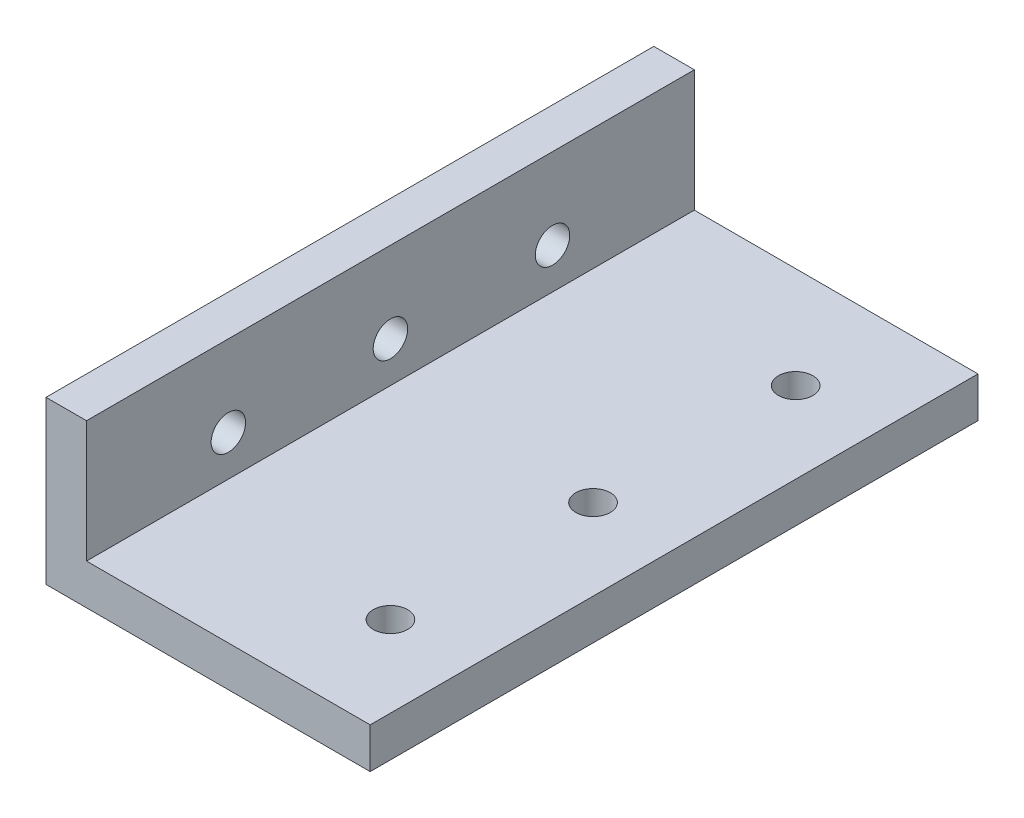
ISO-10303-21;
HEADER;
FILE_DESCRIPTION(('STEP AP214'),'2;1');
FILE_NAME('part.step','',(''),(''),'','','');
FILE_SCHEMA(('AUTOMOTIVE_DESIGN { 1 0 10303 214 1 1 1 1 }'));
ENDSEC;
DATA;
#1=APPLICATION_CONTEXT('core data for automotive mechanical design processes');
#2=APPLICATION_PROTOCOL_DEFINITION('international standard','automotive_design',2000,#1);
#3=PRODUCT_CONTEXT('',#1,'mechanical');
#4=PRODUCT('Part','Part','',(#3));
#5=PRODUCT_RELATED_PRODUCT_CATEGORY('part','',(#4));
#6=PRODUCT_DEFINITION_FORMATION('','',#4);
#7=PRODUCT_DEFINITION_CONTEXT('part definition',#1,'design');
#8=PRODUCT_DEFINITION('design','',#6,#7);
#9=PRODUCT_DEFINITION_SHAPE('','',#8);
#10=(LENGTH_UNIT() NAMED_UNIT(*) SI_UNIT(.MILLI.,.METRE.));
#11=(NAMED_UNIT(*) PLANE_ANGLE_UNIT() SI_UNIT($,.RADIAN.));
#12=(NAMED_UNIT(*) SI_UNIT($,.STERADIAN.) SOLID_ANGLE_UNIT());
#13=UNCERTAINTY_MEASURE_WITH_UNIT(LENGTH_MEASURE(1.E-05),#10,'distance_accuracy_value','');
#14=(GEOMETRIC_REPRESENTATION_CONTEXT(3) GLOBAL_UNCERTAINTY_ASSIGNED_CONTEXT((#13)) GLOBAL_UNIT_ASSIGNED_CONTEXT((#10,
#11,#12)) REPRESENTATION_CONTEXT('',''));
#15=CARTESIAN_POINT('',(0.,0.,0.));
#16=DIRECTION('',(0.,0.,1.));
#17=DIRECTION('',(1.,0.,0.));
#18=AXIS2_PLACEMENT_3D('',#15,#16,#17);
#19=CARTESIAN_POINT('',(10.,40.,150.));
#20=DIRECTION('',(0.,-1.,0.));
#21=DIRECTION('',(0.,0.,-1.));
#22=AXIS2_PLACEMENT_3D('',#19,#20,#21);
#23=PLANE('',#22);
#24=DIRECTION('',(-1.,0.,0.));
#25=VECTOR('',#24,1.);
#26=CARTESIAN_POINT('',(10.,40.,0.));
#27=LINE('',#26,#25);
#28=CARTESIAN_POINT('',(10.,40.,0.));
#29=VERTEX_POINT('',#28);
#30=CARTESIAN_POINT('',(0.,40.,0.));
#31=VERTEX_POINT('',#30);
#32=EDGE_CURVE('E119',#29,#31,#27,.T.);
#33=ORIENTED_EDGE('',*,*,#32,.T.);
#34=DIRECTION('',(0.,0.,-1.));
#35=VECTOR('',#34,1.);
#36=CARTESIAN_POINT('',(0.,40.,150.));
#37=LINE('',#36,#35);
#38=CARTESIAN_POINT('',(0.,40.,150.));
#39=VERTEX_POINT('',#38);
#40=EDGE_CURVE('E11',#39,#31,#37,.T.);
#41=ORIENTED_EDGE('',*,*,#40,.F.);
#42=DIRECTION('',(-1.,0.,0.));
#43=VECTOR('',#42,1.);
#44=CARTESIAN_POINT('',(10.,40.,150.));
#45=LINE('',#44,#43);
#46=CARTESIAN_POINT('',(10.,40.,150.));
#47=VERTEX_POINT('',#46);
#48=EDGE_CURVE('E130',#47,#39,#45,.T.);
#49=ORIENTED_EDGE('',*,*,#48,.F.);
#50=DIRECTION('',(0.,0.,-1.));
#51=VECTOR('',#50,1.);
#52=CARTESIAN_POINT('',(10.,40.,150.));
#53=LINE('',#52,#51);
#54=EDGE_CURVE('E115',#47,#29,#53,.T.);
#55=ORIENTED_EDGE('',*,*,#54,.T.);
#56=EDGE_LOOP('',(#33,#41,#49,#55));
#57=FACE_BOUND('',#56,.T.);
#58=ADVANCED_FACE('F35',(#57),#23,.F.);
#59=CARTESIAN_POINT('',(0.,40.,150.));
#60=DIRECTION('',(1.,0.,0.));
#61=DIRECTION('',(0.,1.,0.));
#62=AXIS2_PLACEMENT_3D('',#59,#60,#61);
#63=PLANE('',#62);
#64=CARTESIAN_POINT('',(0.,20.,115.));
#65=DIRECTION('',(1.,0.,0.));
#66=DIRECTION('',(0.,0.,-1.));
#67=AXIS2_PLACEMENT_3D('',#64,#65,#66);
#68=CIRCLE('',#67,4.25);
#69=CARTESIAN_POINT('',(0.,20.,110.75));
#70=VERTEX_POINT('',#69);
#71=EDGE_CURVE('E285',#70,#70,#68,.T.);
#72=ORIENTED_EDGE('',*,*,#71,.T.);
#73=EDGE_LOOP('',(#72));
#74=FACE_BOUND('',#73,.T.);
#75=CARTESIAN_POINT('',(0.,20.,35.));
#76=DIRECTION('',(1.,0.,0.));
#77=DIRECTION('',(0.,0.,-1.));
#78=AXIS2_PLACEMENT_3D('',#75,#76,#77);
#79=CIRCLE('',#78,4.25);
#80=CARTESIAN_POINT('',(0.,20.,30.75));
#81=VERTEX_POINT('',#80);
#82=EDGE_CURVE('E294',#81,#81,#79,.T.);
#83=ORIENTED_EDGE('',*,*,#82,.T.);
#84=EDGE_LOOP('',(#83));
#85=FACE_BOUND('',#84,.T.);
#86=CARTESIAN_POINT('',(0.,20.,75.));
#87=DIRECTION('',(1.,0.,0.));
#88=DIRECTION('',(0.,0.,-1.));
#89=AXIS2_PLACEMENT_3D('',#86,#87,#88);
#90=CIRCLE('',#89,4.25);
#91=CARTESIAN_POINT('',(0.,20.,70.75));
#92=VERTEX_POINT('',#91);
#93=EDGE_CURVE('E312',#92,#92,#90,.T.);
#94=ORIENTED_EDGE('',*,*,#93,.T.);
#95=EDGE_LOOP('',(#94));
#96=FACE_BOUND('',#95,.T.);
#97=DIRECTION('',(0.,-1.,0.));
#98=VECTOR('',#97,1.);
#99=CARTESIAN_POINT('',(0.,40.,0.));
#100=LINE('',#99,#98);
#101=CARTESIAN_POINT('',(0.,0.,0.));
#102=VERTEX_POINT('',#101);
#103=EDGE_CURVE('E122',#31,#102,#100,.T.);
#104=ORIENTED_EDGE('',*,*,#103,.T.);
#105=DIRECTION('',(0.,0.,-1.));
#106=VECTOR('',#105,1.);
#107=CARTESIAN_POINT('',(0.,0.,150.));
#108=LINE('',#107,#106);
#109=CARTESIAN_POINT('',(0.,0.,150.));
#110=VERTEX_POINT('',#109);
#111=EDGE_CURVE('E43',#110,#102,#108,.T.);
#112=ORIENTED_EDGE('',*,*,#111,.F.);
#113=DIRECTION('',(0.,-1.,0.));
#114=VECTOR('',#113,1.);
#115=CARTESIAN_POINT('',(0.,40.,150.));
#116=LINE('',#115,#114);
#117=EDGE_CURVE('E88',#39,#110,#116,.T.);
#118=ORIENTED_EDGE('',*,*,#117,.F.);
#119=ORIENTED_EDGE('',*,*,#40,.T.);
#120=EDGE_LOOP('',(#104,#112,#118,#119));
#121=FACE_BOUND('',#120,.T.);
#122=ADVANCED_FACE('F158',(#74,#85,#96,#121),#63,.F.);
#123=CARTESIAN_POINT('',(0.,0.,150.));
#124=DIRECTION('',(0.,1.,0.));
#125=DIRECTION('',(0.,0.,1.));
#126=AXIS2_PLACEMENT_3D('',#123,#124,#125);
#127=PLANE('',#126);
#128=CARTESIAN_POINT('',(60.,0.,125.));
#129=DIRECTION('',(0.,1.,0.));
#130=DIRECTION('',(0.,0.,1.));
#131=AXIS2_PLACEMENT_3D('',#128,#129,#130);
#132=CIRCLE('',#131,4.25);
#133=CARTESIAN_POINT('',(60.,0.,129.25));
#134=VERTEX_POINT('',#133);
#135=EDGE_CURVE('E300',#134,#134,#132,.T.);
#136=ORIENTED_EDGE('',*,*,#135,.T.);
#137=EDGE_LOOP('',(#136));
#138=FACE_BOUND('',#137,.T.);
#139=CARTESIAN_POINT('',(60.,0.,25.));
#140=DIRECTION('',(0.,1.,0.));
#141=DIRECTION('',(0.,0.,1.));
#142=AXIS2_PLACEMENT_3D('',#139,#140,#141);
#143=CIRCLE('',#142,4.25);
#144=CARTESIAN_POINT('',(60.,0.,29.25));
#145=VERTEX_POINT('',#144);
#146=EDGE_CURVE('E306',#145,#145,#143,.T.);
#147=ORIENTED_EDGE('',*,*,#146,.T.);
#148=EDGE_LOOP('',(#147));
#149=FACE_BOUND('',#148,.T.);
#150=CARTESIAN_POINT('',(60.,0.,75.));
#151=DIRECTION('',(0.,1.,0.));
#152=DIRECTION('',(0.,0.,1.));
#153=AXIS2_PLACEMENT_3D('',#150,#151,#152);
#154=CIRCLE('',#153,4.24999999999999);
#155=CARTESIAN_POINT('',(60.,0.,79.25));
#156=VERTEX_POINT('',#155);
#157=EDGE_CURVE('E123',#156,#156,#154,.T.);
#158=ORIENTED_EDGE('',*,*,#157,.T.);
#159=EDGE_LOOP('',(#158));
#160=FACE_BOUND('',#159,.T.);
#161=DIRECTION('',(1.,0.,0.));
#162=VECTOR('',#161,1.);
#163=CARTESIAN_POINT('',(0.,0.,0.));
#164=LINE('',#163,#162);
#165=CARTESIAN_POINT('',(80.,0.,0.));
#166=VERTEX_POINT('',#165);
#167=EDGE_CURVE('E125',#102,#166,#164,.T.);
#168=ORIENTED_EDGE('',*,*,#167,.T.);
#169=DIRECTION('',(0.,0.,-1.));
#170=VECTOR('',#169,1.);
#171=CARTESIAN_POINT('',(80.,0.,150.));
#172=LINE('',#171,#170);
#173=CARTESIAN_POINT('',(80.,0.,150.));
#174=VERTEX_POINT('',#173);
#175=EDGE_CURVE('E110',#174,#166,#172,.T.);
#176=ORIENTED_EDGE('',*,*,#175,.F.);
#177=DIRECTION('',(1.,0.,0.));
#178=VECTOR('',#177,1.);
#179=CARTESIAN_POINT('',(0.,0.,150.));
#180=LINE('',#179,#178);
#181=EDGE_CURVE('E101',#110,#174,#180,.T.);
#182=ORIENTED_EDGE('',*,*,#181,.F.);
#183=ORIENTED_EDGE('',*,*,#111,.T.);
#184=EDGE_LOOP('',(#168,#176,#182,#183));
#185=FACE_BOUND('',#184,.T.);
#186=ADVANCED_FACE('F136',(#138,#149,#160,#185),#127,.F.);
#187=CARTESIAN_POINT('',(80.,0.,150.));
#188=DIRECTION('',(-1.,0.,0.));
#189=DIRECTION('',(0.,0.,1.));
#190=AXIS2_PLACEMENT_3D('',#187,#188,#189);
#191=PLANE('',#190);
#192=DIRECTION('',(0.,1.,0.));
#193=VECTOR('',#192,1.);
#194=CARTESIAN_POINT('',(80.,0.,0.));
#195=LINE('',#194,#193);
#196=CARTESIAN_POINT('',(80.,10.,0.));
#197=VERTEX_POINT('',#196);
#198=EDGE_CURVE('E109',#166,#197,#195,.T.);
#199=ORIENTED_EDGE('',*,*,#198,.T.);
#200=DIRECTION('',(0.,0.,-1.));
#201=VECTOR('',#200,1.);
#202=CARTESIAN_POINT('',(80.,10.,150.));
#203=LINE('',#202,#201);
#204=CARTESIAN_POINT('',(80.,10.,150.));
#205=VERTEX_POINT('',#204);
#206=EDGE_CURVE('E106',#205,#197,#203,.T.);
#207=ORIENTED_EDGE('',*,*,#206,.F.);
#208=DIRECTION('',(0.,1.,0.));
#209=VECTOR('',#208,1.);
#210=CARTESIAN_POINT('',(80.,0.,150.));
#211=LINE('',#210,#209);
#212=EDGE_CURVE('E95',#174,#205,#211,.T.);
#213=ORIENTED_EDGE('',*,*,#212,.F.);
#214=ORIENTED_EDGE('',*,*,#175,.T.);
#215=EDGE_LOOP('',(#199,#207,#213,#214));
#216=FACE_BOUND('',#215,.T.);
#217=ADVANCED_FACE('F107',(#216),#191,.F.);
#218=CARTESIAN_POINT('',(80.,10.,150.));
#219=DIRECTION('',(0.,-1.,0.));
#220=DIRECTION('',(1.,0.,0.));
#221=AXIS2_PLACEMENT_3D('',#218,#219,#220);
#222=PLANE('',#221);
#223=CARTESIAN_POINT('',(60.,10.,125.));
#224=DIRECTION('',(0.,1.,0.));
#225=DIRECTION('',(0.,0.,1.));
#226=AXIS2_PLACEMENT_3D('',#223,#224,#225);
#227=CIRCLE('',#226,4.25);
#228=CARTESIAN_POINT('',(60.,10.,129.25));
#229=VERTEX_POINT('',#228);
#230=EDGE_CURVE('E297',#229,#229,#227,.T.);
#231=ORIENTED_EDGE('',*,*,#230,.F.);
#232=EDGE_LOOP('',(#231));
#233=FACE_BOUND('',#232,.T.);
#234=CARTESIAN_POINT('',(60.,10.,25.));
#235=DIRECTION('',(0.,1.,0.));
#236=DIRECTION('',(0.,0.,1.));
#237=AXIS2_PLACEMENT_3D('',#234,#235,#236);
#238=CIRCLE('',#237,4.25);
#239=CARTESIAN_POINT('',(60.,10.,29.25));
#240=VERTEX_POINT('',#239);
#241=EDGE_CURVE('E303',#240,#240,#238,.T.);
#242=ORIENTED_EDGE('',*,*,#241,.F.);
#243=EDGE_LOOP('',(#242));
#244=FACE_BOUND('',#243,.T.);
#245=CARTESIAN_POINT('',(60.,10.,75.));
#246=DIRECTION('',(0.,1.,0.));
#247=DIRECTION('',(0.,0.,1.));
#248=AXIS2_PLACEMENT_3D('',#245,#246,#247);
#249=CIRCLE('',#248,4.25);
#250=CARTESIAN_POINT('',(60.,10.,79.25));
#251=VERTEX_POINT('',#250);
#252=EDGE_CURVE('E315',#251,#251,#249,.T.);
#253=ORIENTED_EDGE('',*,*,#252,.F.);
#254=EDGE_LOOP('',(#253));
#255=FACE_BOUND('',#254,.T.);
#256=DIRECTION('',(-1.,0.,0.));
#257=VECTOR('',#256,1.);
#258=CARTESIAN_POINT('',(80.,10.,0.));
#259=LINE('',#258,#257);
#260=CARTESIAN_POINT('',(10.,10.,0.));
#261=VERTEX_POINT('',#260);
#262=EDGE_CURVE('E74',#197,#261,#259,.T.);
#263=ORIENTED_EDGE('',*,*,#262,.T.);
#264=DIRECTION('',(0.,0.,-1.));
#265=VECTOR('',#264,1.);
#266=CARTESIAN_POINT('',(10.,10.,150.));
#267=LINE('',#266,#265);
#268=CARTESIAN_POINT('',(10.,10.,150.));
#269=VERTEX_POINT('',#268);
#270=EDGE_CURVE('E111',#269,#261,#267,.T.);
#271=ORIENTED_EDGE('',*,*,#270,.F.);
#272=DIRECTION('',(-1.,0.,0.));
#273=VECTOR('',#272,1.);
#274=CARTESIAN_POINT('',(80.,10.,150.));
#275=LINE('',#274,#273);
#276=EDGE_CURVE('E99',#205,#269,#275,.T.);
#277=ORIENTED_EDGE('',*,*,#276,.F.);
#278=ORIENTED_EDGE('',*,*,#206,.T.);
#279=EDGE_LOOP('',(#263,#271,#277,#278));
#280=FACE_BOUND('',#279,.T.);
#281=ADVANCED_FACE('F113',(#233,#244,#255,#280),#222,.F.);
#282=CARTESIAN_POINT('',(10.,10.,150.));
#283=DIRECTION('',(-1.,0.,0.));
#284=DIRECTION('',(0.,0.,1.));
#285=AXIS2_PLACEMENT_3D('',#282,#283,#284);
#286=PLANE('',#285);
#287=CARTESIAN_POINT('',(10.,20.,115.));
#288=DIRECTION('',(1.,0.,0.));
#289=DIRECTION('',(0.,0.,-1.));
#290=AXIS2_PLACEMENT_3D('',#287,#288,#289);
#291=CIRCLE('',#290,4.25);
#292=CARTESIAN_POINT('',(10.,20.,110.75));
#293=VERTEX_POINT('',#292);
#294=EDGE_CURVE('E287',#293,#293,#291,.T.);
#295=ORIENTED_EDGE('',*,*,#294,.F.);
#296=EDGE_LOOP('',(#295));
#297=FACE_BOUND('',#296,.T.);
#298=CARTESIAN_POINT('',(10.,20.,35.));
#299=DIRECTION('',(1.,0.,0.));
#300=DIRECTION('',(0.,0.,-1.));
#301=AXIS2_PLACEMENT_3D('',#298,#299,#300);
#302=CIRCLE('',#301,4.25);
#303=CARTESIAN_POINT('',(10.,20.,30.75));
#304=VERTEX_POINT('',#303);
#305=EDGE_CURVE('E289',#304,#304,#302,.T.);
#306=ORIENTED_EDGE('',*,*,#305,.F.);
#307=EDGE_LOOP('',(#306));
#308=FACE_BOUND('',#307,.T.);
#309=CARTESIAN_POINT('',(10.,20.,75.));
#310=DIRECTION('',(1.,0.,0.));
#311=DIRECTION('',(0.,0.,-1.));
#312=AXIS2_PLACEMENT_3D('',#309,#310,#311);
#313=CIRCLE('',#312,4.25);
#314=CARTESIAN_POINT('',(10.,20.,70.75));
#315=VERTEX_POINT('',#314);
#316=EDGE_CURVE('E309',#315,#315,#313,.T.);
#317=ORIENTED_EDGE('',*,*,#316,.F.);
#318=EDGE_LOOP('',(#317));
#319=FACE_BOUND('',#318,.T.);
#320=DIRECTION('',(0.,1.,0.));
#321=VECTOR('',#320,1.);
#322=CARTESIAN_POINT('',(10.,10.,0.));
#323=LINE('',#322,#321);
#324=EDGE_CURVE('E80',#261,#29,#323,.T.);
#325=ORIENTED_EDGE('',*,*,#324,.T.);
#326=ORIENTED_EDGE('',*,*,#54,.F.);
#327=DIRECTION('',(0.,1.,0.));
#328=VECTOR('',#327,1.);
#329=CARTESIAN_POINT('',(10.,10.,150.));
#330=LINE('',#329,#328);
#331=EDGE_CURVE('E51',#269,#47,#330,.T.);
#332=ORIENTED_EDGE('',*,*,#331,.F.);
#333=ORIENTED_EDGE('',*,*,#270,.T.);
#334=EDGE_LOOP('',(#325,#326,#332,#333));
#335=FACE_BOUND('',#334,.T.);
#336=ADVANCED_FACE('F143',(#297,#308,#319,#335),#286,.F.);
#337=CARTESIAN_POINT('',(0.,0.,150.));
#338=DIRECTION('',(0.,0.,1.));
#339=DIRECTION('',(1.,0.,0.));
#340=AXIS2_PLACEMENT_3D('',#337,#338,#339);
#341=PLANE('',#340);
#342=ORIENTED_EDGE('',*,*,#48,.T.);
#343=ORIENTED_EDGE('',*,*,#117,.T.);
#344=ORIENTED_EDGE('',*,*,#181,.T.);
#345=ORIENTED_EDGE('',*,*,#212,.T.);
#346=ORIENTED_EDGE('',*,*,#276,.T.);
#347=ORIENTED_EDGE('',*,*,#331,.T.);
#348=EDGE_LOOP('',(#342,#343,#344,#345,#346,#347));
#349=FACE_BOUND('',#348,.T.);
#350=ADVANCED_FACE('F97',(#349),#341,.T.);
#351=CARTESIAN_POINT('',(0.,0.,0.));
#352=DIRECTION('',(0.,0.,1.));
#353=DIRECTION('',(1.,0.,0.));
#354=AXIS2_PLACEMENT_3D('',#351,#352,#353);
#355=PLANE('',#354);
#356=ORIENTED_EDGE('',*,*,#32,.F.);
#357=ORIENTED_EDGE('',*,*,#324,.F.);
#358=ORIENTED_EDGE('',*,*,#262,.F.);
#359=ORIENTED_EDGE('',*,*,#198,.F.);
#360=ORIENTED_EDGE('',*,*,#167,.F.);
#361=ORIENTED_EDGE('',*,*,#103,.F.);
#362=EDGE_LOOP('',(#356,#357,#358,#359,#360,#361));
#363=FACE_BOUND('',#362,.T.);
#364=ADVANCED_FACE('F139',(#363),#355,.F.);
#365=CARTESIAN_POINT('',(60.,10.,75.));
#366=DIRECTION('',(0.,1.,0.));
#367=DIRECTION('',(0.,0.,1.));
#368=AXIS2_PLACEMENT_3D('',#365,#366,#367);
#369=CYLINDRICAL_SURFACE('',#368,4.25);
#370=ORIENTED_EDGE('',*,*,#157,.F.);
#371=EDGE_LOOP('',(#370));
#372=FACE_BOUND('',#371,.T.);
#373=ORIENTED_EDGE('',*,*,#252,.T.);
#374=EDGE_LOOP('',(#373));
#375=FACE_BOUND('',#374,.T.);
#376=ADVANCED_FACE('F193',(#372,#375),#369,.F.);
#377=CARTESIAN_POINT('',(10.,20.,75.));
#378=DIRECTION('',(1.,0.,0.));
#379=DIRECTION('',(0.,0.,-1.));
#380=AXIS2_PLACEMENT_3D('',#377,#378,#379);
#381=CYLINDRICAL_SURFACE('',#380,4.25);
#382=ORIENTED_EDGE('',*,*,#93,.F.);
#383=EDGE_LOOP('',(#382));
#384=FACE_BOUND('',#383,.T.);
#385=ORIENTED_EDGE('',*,*,#316,.T.);
#386=EDGE_LOOP('',(#385));
#387=FACE_BOUND('',#386,.T.);
#388=ADVANCED_FACE('F198',(#384,#387),#381,.F.);
#389=CARTESIAN_POINT('',(60.,10.,25.));
#390=DIRECTION('',(0.,1.,0.));
#391=DIRECTION('',(0.,0.,1.));
#392=AXIS2_PLACEMENT_3D('',#389,#390,#391);
#393=CYLINDRICAL_SURFACE('',#392,4.25);
#394=ORIENTED_EDGE('',*,*,#146,.F.);
#395=EDGE_LOOP('',(#394));
#396=FACE_BOUND('',#395,.T.);
#397=ORIENTED_EDGE('',*,*,#241,.T.);
#398=EDGE_LOOP('',(#397));
#399=FACE_BOUND('',#398,.T.);
#400=ADVANCED_FACE('F210',(#396,#399),#393,.F.);
#401=CARTESIAN_POINT('',(60.,10.,125.));
#402=DIRECTION('',(0.,1.,0.));
#403=DIRECTION('',(0.,0.,1.));
#404=AXIS2_PLACEMENT_3D('',#401,#402,#403);
#405=CYLINDRICAL_SURFACE('',#404,4.25);
#406=ORIENTED_EDGE('',*,*,#135,.F.);
#407=EDGE_LOOP('',(#406));
#408=FACE_BOUND('',#407,.T.);
#409=ORIENTED_EDGE('',*,*,#230,.T.);
#410=EDGE_LOOP('',(#409));
#411=FACE_BOUND('',#410,.T.);
#412=ADVANCED_FACE('F221',(#408,#411),#405,.F.);
#413=CARTESIAN_POINT('',(10.,20.,35.));
#414=DIRECTION('',(1.,0.,0.));
#415=DIRECTION('',(0.,0.,-1.));
#416=AXIS2_PLACEMENT_3D('',#413,#414,#415);
#417=CYLINDRICAL_SURFACE('',#416,4.25);
#418=ORIENTED_EDGE('',*,*,#82,.F.);
#419=EDGE_LOOP('',(#418));
#420=FACE_BOUND('',#419,.T.);
#421=ORIENTED_EDGE('',*,*,#305,.T.);
#422=EDGE_LOOP('',(#421));
#423=FACE_BOUND('',#422,.T.);
#424=ADVANCED_FACE('F232',(#420,#423),#417,.F.);
#425=CARTESIAN_POINT('',(10.,20.,115.));
#426=DIRECTION('',(1.,0.,0.));
#427=DIRECTION('',(0.,0.,-1.));
#428=AXIS2_PLACEMENT_3D('',#425,#426,#427);
#429=CYLINDRICAL_SURFACE('',#428,4.25);
#430=ORIENTED_EDGE('',*,*,#71,.F.);
#431=EDGE_LOOP('',(#430));
#432=FACE_BOUND('',#431,.T.);
#433=ORIENTED_EDGE('',*,*,#294,.T.);
#434=EDGE_LOOP('',(#433));
#435=FACE_BOUND('',#434,.T.);
#436=ADVANCED_FACE('F243',(#432,#435),#429,.F.);
#437=CLOSED_SHELL('',(#58,#122,#186,#217,#281,#336,#350,#364,#376,#388,#400,#412,#424,#436));
#438=MANIFOLD_SOLID_BREP('B2',#437);
#439=ADVANCED_BREP_SHAPE_REPRESENTATION('',(#18,#438),#14);
#440=SHAPE_DEFINITION_REPRESENTATION(#9,#439);
ENDSEC;
END-ISO-10303-21;
